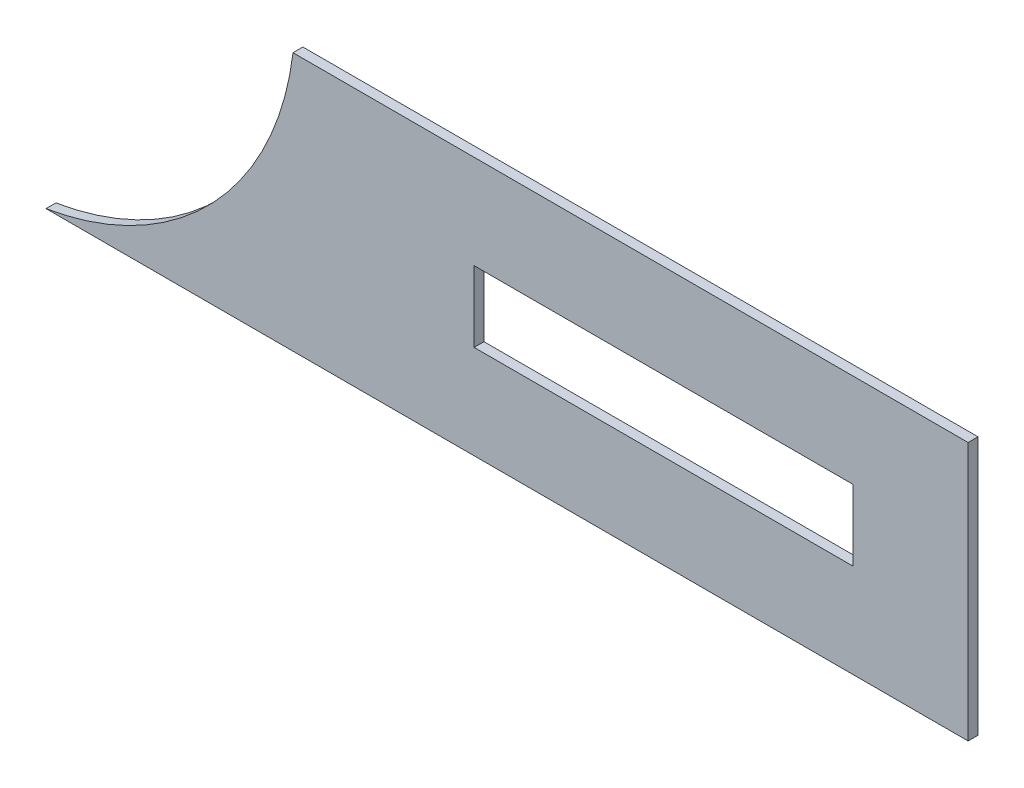
ISO-10303-21;
HEADER;
FILE_DESCRIPTION(('STEP AP214'),'2;1');
FILE_NAME('part.step','',(''),(''),'','','');
FILE_SCHEMA(('AUTOMOTIVE_DESIGN { 1 0 10303 214 1 1 1 1 }'));
ENDSEC;
DATA;
#1=APPLICATION_CONTEXT('core data for automotive mechanical design processes');
#2=APPLICATION_PROTOCOL_DEFINITION('international standard','automotive_design',2000,#1);
#3=PRODUCT_CONTEXT('',#1,'mechanical');
#4=PRODUCT('Part','Part','',(#3));
#5=PRODUCT_RELATED_PRODUCT_CATEGORY('part','',(#4));
#6=PRODUCT_DEFINITION_FORMATION('','',#4);
#7=PRODUCT_DEFINITION_CONTEXT('part definition',#1,'design');
#8=PRODUCT_DEFINITION('design','',#6,#7);
#9=PRODUCT_DEFINITION_SHAPE('','',#8);
#10=(LENGTH_UNIT() NAMED_UNIT(*) SI_UNIT(.MILLI.,.METRE.));
#11=(NAMED_UNIT(*) PLANE_ANGLE_UNIT() SI_UNIT($,.RADIAN.));
#12=(NAMED_UNIT(*) SI_UNIT($,.STERADIAN.) SOLID_ANGLE_UNIT());
#13=UNCERTAINTY_MEASURE_WITH_UNIT(LENGTH_MEASURE(1.E-05),#10,'distance_accuracy_value','');
#14=(GEOMETRIC_REPRESENTATION_CONTEXT(3) GLOBAL_UNCERTAINTY_ASSIGNED_CONTEXT((#13)) GLOBAL_UNIT_ASSIGNED_CONTEXT((#10,
#11,#12)) REPRESENTATION_CONTEXT('',''));
#15=CARTESIAN_POINT('',(0.,0.,0.));
#16=DIRECTION('',(0.,0.,1.));
#17=DIRECTION('',(1.,0.,0.));
#18=AXIS2_PLACEMENT_3D('',#15,#16,#17);
#19=CARTESIAN_POINT('',(-2.98724791177452,17.8696636099757,0.600000000000017));
#20=DIRECTION('',(0.,0.,1.));
#21=DIRECTION('',(1.,0.,0.));
#22=AXIS2_PLACEMENT_3D('',#19,#20,#21);
#23=PLANE('',#22);
#24=CARTESIAN_POINT('',(-2.98724791177452,17.8696636099757,0.600000000000017));
#25=DIRECTION('',(0.,0.,-1.));
#26=DIRECTION('',(1.,0.,0.));
#27=AXIS2_PLACEMENT_3D('',#24,#25,#26);
#28=CIRCLE('',#27,18.1176302981403);
#29=CARTESIAN_POINT('',(15.,15.7,0.600000000000017));
#30=VERTEX_POINT('',#29);
#31=CARTESIAN_POINT('',(0.,0.,0.599999999999989));
#32=VERTEX_POINT('',#31);
#33=EDGE_CURVE('E135',#30,#32,#28,.T.);
#34=ORIENTED_EDGE('',*,*,#33,.T.);
#35=DIRECTION('',(1.,0.,0.));
#36=VECTOR('',#35,1.);
#37=CARTESIAN_POINT('',(0.,0.,0.599999999999989));
#38=LINE('',#37,#36);
#39=CARTESIAN_POINT('',(56.,0.,0.599999999999989));
#40=VERTEX_POINT('',#39);
#41=EDGE_CURVE('E138',#32,#40,#38,.T.);
#42=ORIENTED_EDGE('',*,*,#41,.T.);
#43=DIRECTION('',(0.,1.,0.));
#44=VECTOR('',#43,1.);
#45=CARTESIAN_POINT('',(56.,0.,0.599999999999989));
#46=LINE('',#45,#44);
#47=CARTESIAN_POINT('',(56.,15.7,0.600000000000017));
#48=VERTEX_POINT('',#47);
#49=EDGE_CURVE('E141',#40,#48,#46,.T.);
#50=ORIENTED_EDGE('',*,*,#49,.T.);
#51=DIRECTION('',(-1.,0.,0.));
#52=VECTOR('',#51,1.);
#53=CARTESIAN_POINT('',(15.,15.7,0.600000000000017));
#54=LINE('',#53,#52);
#55=EDGE_CURVE('E143',#48,#30,#54,.T.);
#56=ORIENTED_EDGE('',*,*,#55,.T.);
#57=EDGE_LOOP('',(#34,#42,#50,#56));
#58=FACE_BOUND('',#57,.T.);
#59=DIRECTION('',(1.,0.,0.));
#60=VECTOR('',#59,1.);
#61=CARTESIAN_POINT('',(26.,5.7,0.599999999999989));
#62=LINE('',#61,#60);
#63=CARTESIAN_POINT('',(26.,5.7,0.599999999999989));
#64=VERTEX_POINT('',#63);
#65=CARTESIAN_POINT('',(49.,5.7,0.599999999999989));
#66=VERTEX_POINT('',#65);
#67=EDGE_CURVE('E107',#64,#66,#62,.T.);
#68=ORIENTED_EDGE('',*,*,#67,.F.);
#69=DIRECTION('',(0.,-1.,0.));
#70=VECTOR('',#69,1.);
#71=CARTESIAN_POINT('',(26.,5.7,0.599999999999989));
#72=LINE('',#71,#70);
#73=CARTESIAN_POINT('',(26.,10.,0.600000000000017));
#74=VERTEX_POINT('',#73);
#75=EDGE_CURVE('E99',#74,#64,#72,.T.);
#76=ORIENTED_EDGE('',*,*,#75,.F.);
#77=DIRECTION('',(-1.,0.,0.));
#78=VECTOR('',#77,1.);
#79=CARTESIAN_POINT('',(26.,10.,0.600000000000017));
#80=LINE('',#79,#78);
#81=CARTESIAN_POINT('',(49.,10.,0.600000000000017));
#82=VERTEX_POINT('',#81);
#83=EDGE_CURVE('E121',#82,#74,#80,.T.);
#84=ORIENTED_EDGE('',*,*,#83,.F.);
#85=DIRECTION('',(0.,1.,0.));
#86=VECTOR('',#85,1.);
#87=CARTESIAN_POINT('',(49.,5.7,0.599999999999989));
#88=LINE('',#87,#86);
#89=EDGE_CURVE('E119',#66,#82,#88,.T.);
#90=ORIENTED_EDGE('',*,*,#89,.F.);
#91=EDGE_LOOP('',(#68,#76,#84,#90));
#92=FACE_BOUND('',#91,.T.);
#93=ADVANCED_FACE('F34',(#58,#92),#23,.T.);
#94=CARTESIAN_POINT('',(-2.98724791177452,17.8696636099757,0.));
#95=DIRECTION('',(0.,0.,1.));
#96=DIRECTION('',(1.,0.,0.));
#97=AXIS2_PLACEMENT_3D('',#94,#95,#96);
#98=PLANE('',#97);
#99=CARTESIAN_POINT('',(-2.98724791177452,17.8696636099757,0.));
#100=DIRECTION('',(0.,0.,-1.));
#101=DIRECTION('',(1.,0.,0.));
#102=AXIS2_PLACEMENT_3D('',#99,#100,#101);
#103=CIRCLE('',#102,18.1176302981403);
#104=CARTESIAN_POINT('',(15.,15.7,0.));
#105=VERTEX_POINT('',#104);
#106=CARTESIAN_POINT('',(0.,0.,0.));
#107=VERTEX_POINT('',#106);
#108=EDGE_CURVE('E115',#105,#107,#103,.T.);
#109=ORIENTED_EDGE('',*,*,#108,.F.);
#110=DIRECTION('',(-1.,0.,0.));
#111=VECTOR('',#110,1.);
#112=CARTESIAN_POINT('',(15.,15.7,0.));
#113=LINE('',#112,#111);
#114=CARTESIAN_POINT('',(56.,15.7,0.));
#115=VERTEX_POINT('',#114);
#116=EDGE_CURVE('E139',#115,#105,#113,.T.);
#117=ORIENTED_EDGE('',*,*,#116,.F.);
#118=DIRECTION('',(0.,1.,0.));
#119=VECTOR('',#118,1.);
#120=CARTESIAN_POINT('',(56.,0.,0.));
#121=LINE('',#120,#119);
#122=CARTESIAN_POINT('',(56.,0.,0.));
#123=VERTEX_POINT('',#122);
#124=EDGE_CURVE('E150',#123,#115,#121,.T.);
#125=ORIENTED_EDGE('',*,*,#124,.F.);
#126=DIRECTION('',(1.,0.,0.));
#127=VECTOR('',#126,1.);
#128=CARTESIAN_POINT('',(0.,0.,0.));
#129=LINE('',#128,#127);
#130=EDGE_CURVE('E148',#107,#123,#129,.T.);
#131=ORIENTED_EDGE('',*,*,#130,.F.);
#132=EDGE_LOOP('',(#109,#117,#125,#131));
#133=FACE_BOUND('',#132,.T.);
#134=DIRECTION('',(0.,-1.,0.));
#135=VECTOR('',#134,1.);
#136=CARTESIAN_POINT('',(26.,5.7,0.));
#137=LINE('',#136,#135);
#138=CARTESIAN_POINT('',(26.,10.,0.));
#139=VERTEX_POINT('',#138);
#140=CARTESIAN_POINT('',(26.,5.7,0.));
#141=VERTEX_POINT('',#140);
#142=EDGE_CURVE('E57',#139,#141,#137,.T.);
#143=ORIENTED_EDGE('',*,*,#142,.T.);
#144=DIRECTION('',(1.,0.,0.));
#145=VECTOR('',#144,1.);
#146=CARTESIAN_POINT('',(26.,5.7,0.));
#147=LINE('',#146,#145);
#148=CARTESIAN_POINT('',(49.,5.7,0.));
#149=VERTEX_POINT('',#148);
#150=EDGE_CURVE('E114',#141,#149,#147,.T.);
#151=ORIENTED_EDGE('',*,*,#150,.T.);
#152=DIRECTION('',(0.,1.,0.));
#153=VECTOR('',#152,1.);
#154=CARTESIAN_POINT('',(49.,5.7,0.));
#155=LINE('',#154,#153);
#156=CARTESIAN_POINT('',(49.,10.,0.));
#157=VERTEX_POINT('',#156);
#158=EDGE_CURVE('E127',#149,#157,#155,.T.);
#159=ORIENTED_EDGE('',*,*,#158,.T.);
#160=DIRECTION('',(-1.,0.,0.));
#161=VECTOR('',#160,1.);
#162=CARTESIAN_POINT('',(26.,10.,0.));
#163=LINE('',#162,#161);
#164=EDGE_CURVE('E108',#157,#139,#163,.T.);
#165=ORIENTED_EDGE('',*,*,#164,.T.);
#166=EDGE_LOOP('',(#143,#151,#159,#165));
#167=FACE_BOUND('',#166,.T.);
#168=ADVANCED_FACE('F168',(#133,#167),#98,.F.);
#169=CARTESIAN_POINT('',(-2.98724791177452,17.8696636099757,0.600000000000017));
#170=DIRECTION('',(0.,0.,-1.));
#171=DIRECTION('',(-1.,0.,0.));
#172=AXIS2_PLACEMENT_3D('',#169,#170,#171);
#173=CYLINDRICAL_SURFACE('',#172,18.1176302981403);
#174=ORIENTED_EDGE('',*,*,#108,.T.);
#175=DIRECTION('',(0.,0.,-1.));
#176=VECTOR('',#175,1.);
#177=CARTESIAN_POINT('',(0.,0.,0.599999999999989));
#178=LINE('',#177,#176);
#179=EDGE_CURVE('E11',#32,#107,#178,.T.);
#180=ORIENTED_EDGE('',*,*,#179,.F.);
#181=ORIENTED_EDGE('',*,*,#33,.F.);
#182=DIRECTION('',(0.,0.,-1.));
#183=VECTOR('',#182,1.);
#184=CARTESIAN_POINT('',(15.,15.7,0.600000000000017));
#185=LINE('',#184,#183);
#186=EDGE_CURVE('E145',#30,#105,#185,.T.);
#187=ORIENTED_EDGE('',*,*,#186,.T.);
#188=EDGE_LOOP('',(#174,#180,#181,#187));
#189=FACE_BOUND('',#188,.T.);
#190=ADVANCED_FACE('F36',(#189),#173,.F.);
#191=CARTESIAN_POINT('',(0.,0.,0.599999999999989));
#192=DIRECTION('',(0.,1.,0.));
#193=DIRECTION('',(0.,0.,1.));
#194=AXIS2_PLACEMENT_3D('',#191,#192,#193);
#195=PLANE('',#194);
#196=ORIENTED_EDGE('',*,*,#130,.T.);
#197=DIRECTION('',(0.,0.,-1.));
#198=VECTOR('',#197,1.);
#199=CARTESIAN_POINT('',(56.,0.,0.599999999999989));
#200=LINE('',#199,#198);
#201=EDGE_CURVE('E42',#40,#123,#200,.T.);
#202=ORIENTED_EDGE('',*,*,#201,.F.);
#203=ORIENTED_EDGE('',*,*,#41,.F.);
#204=ORIENTED_EDGE('',*,*,#179,.T.);
#205=EDGE_LOOP('',(#196,#202,#203,#204));
#206=FACE_BOUND('',#205,.T.);
#207=ADVANCED_FACE('F178',(#206),#195,.F.);
#208=CARTESIAN_POINT('',(56.,0.,0.599999999999989));
#209=DIRECTION('',(-1.,0.,0.));
#210=DIRECTION('',(0.,0.,1.));
#211=AXIS2_PLACEMENT_3D('',#208,#209,#210);
#212=PLANE('',#211);
#213=ORIENTED_EDGE('',*,*,#124,.T.);
#214=DIRECTION('',(0.,0.,-1.));
#215=VECTOR('',#214,1.);
#216=CARTESIAN_POINT('',(56.,15.7,0.600000000000017));
#217=LINE('',#216,#215);
#218=EDGE_CURVE('E155',#48,#115,#217,.T.);
#219=ORIENTED_EDGE('',*,*,#218,.F.);
#220=ORIENTED_EDGE('',*,*,#49,.F.);
#221=ORIENTED_EDGE('',*,*,#201,.T.);
#222=EDGE_LOOP('',(#213,#219,#220,#221));
#223=FACE_BOUND('',#222,.T.);
#224=ADVANCED_FACE('F162',(#223),#212,.F.);
#225=CARTESIAN_POINT('',(15.,15.7,0.600000000000017));
#226=DIRECTION('',(0.,-1.,0.));
#227=DIRECTION('',(0.,0.,-1.));
#228=AXIS2_PLACEMENT_3D('',#225,#226,#227);
#229=PLANE('',#228);
#230=ORIENTED_EDGE('',*,*,#116,.T.);
#231=ORIENTED_EDGE('',*,*,#186,.F.);
#232=ORIENTED_EDGE('',*,*,#55,.F.);
#233=ORIENTED_EDGE('',*,*,#218,.T.);
#234=EDGE_LOOP('',(#230,#231,#232,#233));
#235=FACE_BOUND('',#234,.T.);
#236=ADVANCED_FACE('F172',(#235),#229,.F.);
#237=CARTESIAN_POINT('',(26.,5.7,0.599999999999989));
#238=DIRECTION('',(1.,0.,0.));
#239=DIRECTION('',(0.,0.,-1.));
#240=AXIS2_PLACEMENT_3D('',#237,#238,#239);
#241=PLANE('',#240);
#242=ORIENTED_EDGE('',*,*,#142,.F.);
#243=DIRECTION('',(0.,0.,-1.));
#244=VECTOR('',#243,1.);
#245=CARTESIAN_POINT('',(26.,10.,0.600000000000017));
#246=LINE('',#245,#244);
#247=EDGE_CURVE('E103',#74,#139,#246,.T.);
#248=ORIENTED_EDGE('',*,*,#247,.F.);
#249=ORIENTED_EDGE('',*,*,#75,.T.);
#250=DIRECTION('',(0.,0.,-1.));
#251=VECTOR('',#250,1.);
#252=CARTESIAN_POINT('',(26.,5.7,0.599999999999989));
#253=LINE('',#252,#251);
#254=EDGE_CURVE('E102',#64,#141,#253,.T.);
#255=ORIENTED_EDGE('',*,*,#254,.T.);
#256=EDGE_LOOP('',(#242,#248,#249,#255));
#257=FACE_BOUND('',#256,.T.);
#258=ADVANCED_FACE('F101',(#257),#241,.T.);
#259=CARTESIAN_POINT('',(26.,5.7,0.599999999999989));
#260=DIRECTION('',(0.,1.,0.));
#261=DIRECTION('',(0.,0.,1.));
#262=AXIS2_PLACEMENT_3D('',#259,#260,#261);
#263=PLANE('',#262);
#264=ORIENTED_EDGE('',*,*,#150,.F.);
#265=ORIENTED_EDGE('',*,*,#254,.F.);
#266=ORIENTED_EDGE('',*,*,#67,.T.);
#267=DIRECTION('',(0.,0.,-1.));
#268=VECTOR('',#267,1.);
#269=CARTESIAN_POINT('',(49.,5.7,0.599999999999989));
#270=LINE('',#269,#268);
#271=EDGE_CURVE('E116',#66,#149,#270,.T.);
#272=ORIENTED_EDGE('',*,*,#271,.T.);
#273=EDGE_LOOP('',(#264,#265,#266,#272));
#274=FACE_BOUND('',#273,.T.);
#275=ADVANCED_FACE('F111',(#274),#263,.T.);
#276=CARTESIAN_POINT('',(49.,5.7,0.599999999999989));
#277=DIRECTION('',(-1.,0.,0.));
#278=DIRECTION('',(0.,0.,1.));
#279=AXIS2_PLACEMENT_3D('',#276,#277,#278);
#280=PLANE('',#279);
#281=ORIENTED_EDGE('',*,*,#158,.F.);
#282=ORIENTED_EDGE('',*,*,#271,.F.);
#283=ORIENTED_EDGE('',*,*,#89,.T.);
#284=DIRECTION('',(0.,0.,-1.));
#285=VECTOR('',#284,1.);
#286=CARTESIAN_POINT('',(49.,10.,0.600000000000017));
#287=LINE('',#286,#285);
#288=EDGE_CURVE('E49',#82,#157,#287,.T.);
#289=ORIENTED_EDGE('',*,*,#288,.T.);
#290=EDGE_LOOP('',(#281,#282,#283,#289));
#291=FACE_BOUND('',#290,.T.);
#292=ADVANCED_FACE('F201',(#291),#280,.T.);
#293=CARTESIAN_POINT('',(26.,10.,0.600000000000017));
#294=DIRECTION('',(0.,-1.,0.));
#295=DIRECTION('',(0.,0.,-1.));
#296=AXIS2_PLACEMENT_3D('',#293,#294,#295);
#297=PLANE('',#296);
#298=ORIENTED_EDGE('',*,*,#164,.F.);
#299=ORIENTED_EDGE('',*,*,#288,.F.);
#300=ORIENTED_EDGE('',*,*,#83,.T.);
#301=ORIENTED_EDGE('',*,*,#247,.T.);
#302=EDGE_LOOP('',(#298,#299,#300,#301));
#303=FACE_BOUND('',#302,.T.);
#304=ADVANCED_FACE('F205',(#303),#297,.T.);
#305=CLOSED_SHELL('',(#93,#168,#190,#207,#224,#236,#258,#275,#292,#304));
#306=MANIFOLD_SOLID_BREP('B2',#305);
#307=ADVANCED_BREP_SHAPE_REPRESENTATION('',(#18,#306),#14);
#308=SHAPE_DEFINITION_REPRESENTATION(#9,#307);
ENDSEC;
END-ISO-10303-21;
